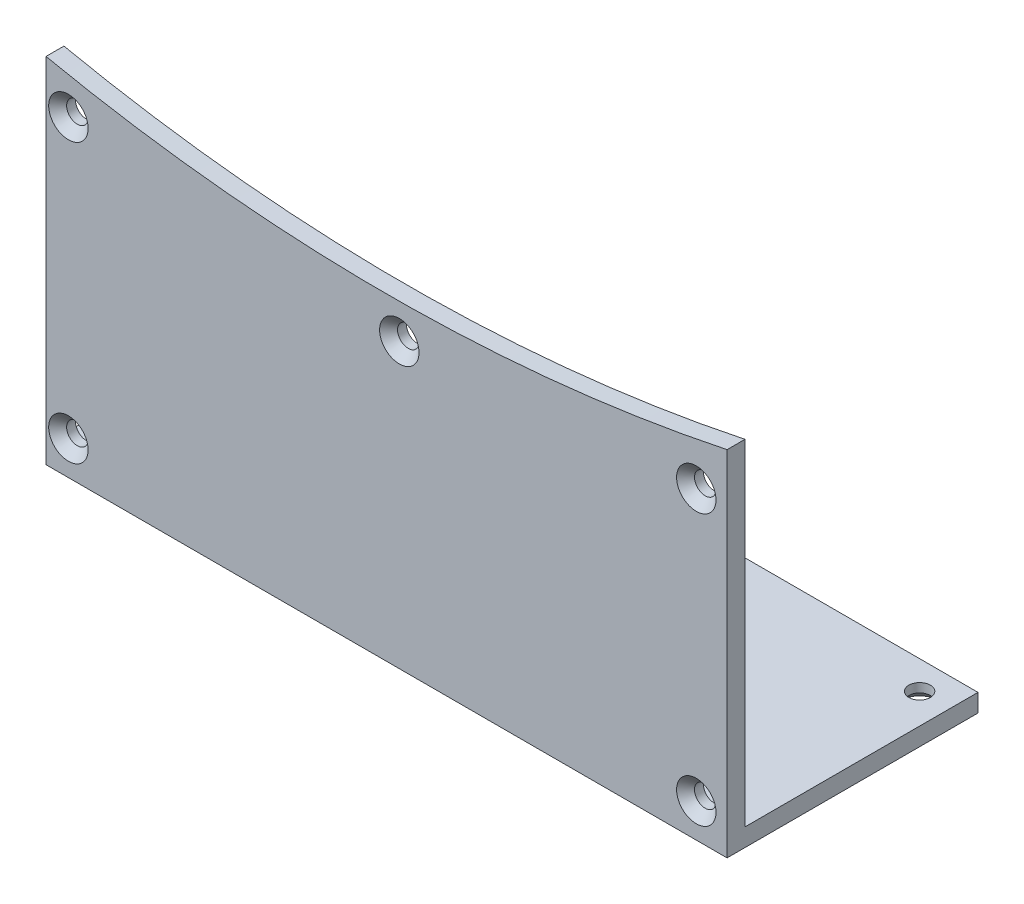
ISO-10303-21;
HEADER;
FILE_DESCRIPTION(('STEP AP214'),'2;1');
FILE_NAME('part.step','',(''),(''),'','','');
FILE_SCHEMA(('AUTOMOTIVE_DESIGN { 1 0 10303 214 1 1 1 1 }'));
ENDSEC;
DATA;
#1=APPLICATION_CONTEXT('core data for automotive mechanical design processes');
#2=APPLICATION_PROTOCOL_DEFINITION('international standard','automotive_design',2000,#1);
#3=PRODUCT_CONTEXT('',#1,'mechanical');
#4=PRODUCT('Part','Part','',(#3));
#5=PRODUCT_RELATED_PRODUCT_CATEGORY('part','',(#4));
#6=PRODUCT_DEFINITION_FORMATION('','',#4);
#7=PRODUCT_DEFINITION_CONTEXT('part definition',#1,'design');
#8=PRODUCT_DEFINITION('design','',#6,#7);
#9=PRODUCT_DEFINITION_SHAPE('','',#8);
#10=(LENGTH_UNIT() NAMED_UNIT(*) SI_UNIT(.MILLI.,.METRE.));
#11=(NAMED_UNIT(*) PLANE_ANGLE_UNIT() SI_UNIT($,.RADIAN.));
#12=(NAMED_UNIT(*) SI_UNIT($,.STERADIAN.) SOLID_ANGLE_UNIT());
#13=UNCERTAINTY_MEASURE_WITH_UNIT(LENGTH_MEASURE(1.E-05),#10,'distance_accuracy_value','');
#14=(GEOMETRIC_REPRESENTATION_CONTEXT(3) GLOBAL_UNCERTAINTY_ASSIGNED_CONTEXT((#13)) GLOBAL_UNIT_ASSIGNED_CONTEXT((#10,
#11,#12)) REPRESENTATION_CONTEXT('',''));
#15=CARTESIAN_POINT('',(0.,0.,0.));
#16=DIRECTION('',(0.,0.,1.));
#17=DIRECTION('',(1.,0.,0.));
#18=AXIS2_PLACEMENT_3D('',#15,#16,#17);
#19=CARTESIAN_POINT('',(0.,0.,-2.));
#20=DIRECTION('',(0.,0.,1.));
#21=DIRECTION('',(1.,0.,0.));
#22=AXIS2_PLACEMENT_3D('',#19,#20,#21);
#23=PLANE('',#22);
#24=CARTESIAN_POINT('',(-35.5,-216.21763850369,-2.));
#25=DIRECTION('',(0.,0.,1.));
#26=DIRECTION('',(1.,0.,0.));
#27=AXIS2_PLACEMENT_3D('',#24,#25,#26);
#28=CIRCLE('',#27,1.2);
#29=CARTESIAN_POINT('',(-34.3,-216.21763850369,-2.));
#30=VERTEX_POINT('',#29);
#31=EDGE_CURVE('E129',#30,#30,#28,.T.);
#32=ORIENTED_EDGE('',*,*,#31,.T.);
#33=EDGE_LOOP('',(#32));
#34=FACE_BOUND('',#33,.T.);
#35=CARTESIAN_POINT('',(-35.5,-185.148473071372,-2.));
#36=DIRECTION('',(0.,0.,1.));
#37=DIRECTION('',(1.,0.,0.));
#38=AXIS2_PLACEMENT_3D('',#35,#36,#37);
#39=CIRCLE('',#38,1.2);
#40=CARTESIAN_POINT('',(-34.3,-185.148473071372,-2.));
#41=VERTEX_POINT('',#40);
#42=EDGE_CURVE('E124',#41,#41,#39,.T.);
#43=ORIENTED_EDGE('',*,*,#42,.T.);
#44=EDGE_LOOP('',(#43));
#45=FACE_BOUND('',#44,.T.);
#46=CARTESIAN_POINT('',(1.42507067583593,-188.349538600762,-2.));
#47=DIRECTION('',(0.,0.,1.));
#48=DIRECTION('',(1.,0.,0.));
#49=AXIS2_PLACEMENT_3D('',#46,#47,#48);
#50=CIRCLE('',#49,1.19999999999999);
#51=CARTESIAN_POINT('',(2.62507067583592,-188.349538600762,-2.));
#52=VERTEX_POINT('',#51);
#53=EDGE_CURVE('E119',#52,#52,#50,.T.);
#54=ORIENTED_EDGE('',*,*,#53,.T.);
#55=EDGE_LOOP('',(#54));
#56=FACE_BOUND('',#55,.T.);
#57=CARTESIAN_POINT('',(34.5655138036417,-186.027196942185,-2.));
#58=DIRECTION('',(0.,0.,1.));
#59=DIRECTION('',(1.,0.,0.));
#60=AXIS2_PLACEMENT_3D('',#57,#58,#59);
#61=CIRCLE('',#60,1.19999999999999);
#62=CARTESIAN_POINT('',(35.7655138036417,-186.027196942185,-2.));
#63=VERTEX_POINT('',#62);
#64=EDGE_CURVE('E114',#63,#63,#61,.T.);
#65=ORIENTED_EDGE('',*,*,#64,.T.);
#66=EDGE_LOOP('',(#65));
#67=FACE_BOUND('',#66,.T.);
#68=CARTESIAN_POINT('',(34.5655138036417,-216.21763850369,-2.));
#69=DIRECTION('',(0.,0.,1.));
#70=DIRECTION('',(1.,0.,0.));
#71=AXIS2_PLACEMENT_3D('',#68,#69,#70);
#72=CIRCLE('',#71,1.19999999999999);
#73=CARTESIAN_POINT('',(35.7655138036417,-216.21763850369,-2.));
#74=VERTEX_POINT('',#73);
#75=EDGE_CURVE('E110',#74,#74,#72,.T.);
#76=ORIENTED_EDGE('',*,*,#75,.T.);
#77=EDGE_LOOP('',(#76));
#78=FACE_BOUND('',#77,.T.);
#79=DIRECTION('',(1.,0.,0.));
#80=VECTOR('',#79,1.);
#81=CARTESIAN_POINT('',(-38.,-218.,-2.));
#82=LINE('',#81,#80);
#83=CARTESIAN_POINT('',(-38.,-218.,-2.));
#84=VERTEX_POINT('',#83);
#85=CARTESIAN_POINT('',(38.,-218.,-2.));
#86=VERTEX_POINT('',#85);
#87=EDGE_CURVE('E50',#84,#86,#82,.T.);
#88=ORIENTED_EDGE('',*,*,#87,.F.);
#89=DIRECTION('',(0.,-1.,0.));
#90=VECTOR('',#89,1.);
#91=CARTESIAN_POINT('',(-38.,-180.544315889479,-2.));
#92=LINE('',#91,#90);
#93=CARTESIAN_POINT('',(-38.,-180.544315889479,-2.));
#94=VERTEX_POINT('',#93);
#95=EDGE_CURVE('E109',#94,#84,#92,.T.);
#96=ORIENTED_EDGE('',*,*,#95,.F.);
#97=CARTESIAN_POINT('',(0.,0.,-2.));
#98=DIRECTION('',(0.,0.,-1.));
#99=DIRECTION('',(1.,0.,0.));
#100=AXIS2_PLACEMENT_3D('',#97,#98,#99);
#101=CIRCLE('',#100,184.5);
#102=CARTESIAN_POINT('',(38.,-180.544315889479,-2.));
#103=VERTEX_POINT('',#102);
#104=EDGE_CURVE('E100',#103,#94,#101,.T.);
#105=ORIENTED_EDGE('',*,*,#104,.F.);
#106=DIRECTION('',(0.,1.,0.));
#107=VECTOR('',#106,1.);
#108=CARTESIAN_POINT('',(38.,-220.,-2.));
#109=LINE('',#108,#107);
#110=EDGE_CURVE('E98',#86,#103,#109,.T.);
#111=ORIENTED_EDGE('',*,*,#110,.F.);
#112=EDGE_LOOP('',(#88,#96,#105,#111));
#113=FACE_BOUND('',#112,.T.);
#114=ADVANCED_FACE('F33',(#34,#45,#56,#67,#78,#113),#23,.F.);
#115=CARTESIAN_POINT('',(-38.,-220.,-2.));
#116=DIRECTION('',(0.,-1.,0.));
#117=DIRECTION('',(0.,0.,-1.));
#118=AXIS2_PLACEMENT_3D('',#115,#116,#117);
#119=PLANE('',#118);
#120=CARTESIAN_POINT('',(34.6439633192261,-220.,-24.8415260383013));
#121=DIRECTION('',(0.,-1.,0.));
#122=DIRECTION('',(0.,0.,-1.));
#123=AXIS2_PLACEMENT_3D('',#120,#121,#122);
#124=CIRCLE('',#123,2.2);
#125=CARTESIAN_POINT('',(34.6439633192261,-220.,-27.0415260383013));
#126=VERTEX_POINT('',#125);
#127=EDGE_CURVE('E455',#126,#126,#124,.T.);
#128=ORIENTED_EDGE('',*,*,#127,.F.);
#129=EDGE_LOOP('',(#128));
#130=FACE_BOUND('',#129,.T.);
#131=CARTESIAN_POINT('',(0.,-220.,-25.6881159443765));
#132=DIRECTION('',(0.,-1.,0.));
#133=DIRECTION('',(0.,0.,-1.));
#134=AXIS2_PLACEMENT_3D('',#131,#132,#133);
#135=CIRCLE('',#134,2.2);
#136=CARTESIAN_POINT('',(0.,-220.,-27.8881159443765));
#137=VERTEX_POINT('',#136);
#138=EDGE_CURVE('E147',#137,#137,#135,.T.);
#139=ORIENTED_EDGE('',*,*,#138,.F.);
#140=EDGE_LOOP('',(#139));
#141=FACE_BOUND('',#140,.T.);
#142=CARTESIAN_POINT('',(-32.9665594764776,-220.,-23.5051324718256));
#143=DIRECTION('',(0.,-1.,0.));
#144=DIRECTION('',(0.,0.,-1.));
#145=AXIS2_PLACEMENT_3D('',#142,#143,#144);
#146=CIRCLE('',#145,2.2);
#147=CARTESIAN_POINT('',(-32.9665594764776,-220.,-25.7051324718256));
#148=VERTEX_POINT('',#147);
#149=EDGE_CURVE('E140',#148,#148,#146,.T.);
#150=ORIENTED_EDGE('',*,*,#149,.F.);
#151=EDGE_LOOP('',(#150));
#152=FACE_BOUND('',#151,.T.);
#153=DIRECTION('',(1.,0.,0.));
#154=VECTOR('',#153,1.);
#155=CARTESIAN_POINT('',(-38.,-220.,0.));
#156=LINE('',#155,#154);
#157=CARTESIAN_POINT('',(-38.,-220.,0.));
#158=VERTEX_POINT('',#157);
#159=CARTESIAN_POINT('',(38.,-220.,0.));
#160=VERTEX_POINT('',#159);
#161=EDGE_CURVE('E86',#158,#160,#156,.T.);
#162=ORIENTED_EDGE('',*,*,#161,.F.);
#163=DIRECTION('',(0.,0.,1.));
#164=VECTOR('',#163,1.);
#165=CARTESIAN_POINT('',(-38.,-220.,-2.));
#166=LINE('',#165,#164);
#167=CARTESIAN_POINT('',(-38.,-220.,-28.));
#168=VERTEX_POINT('',#167);
#169=EDGE_CURVE('E11',#168,#158,#166,.T.);
#170=ORIENTED_EDGE('',*,*,#169,.F.);
#171=DIRECTION('',(1.,0.,0.));
#172=VECTOR('',#171,1.);
#173=CARTESIAN_POINT('',(-38.,-220.,-28.));
#174=LINE('',#173,#172);
#175=CARTESIAN_POINT('',(38.,-220.,-28.));
#176=VERTEX_POINT('',#175);
#177=EDGE_CURVE('E184',#168,#176,#174,.T.);
#178=ORIENTED_EDGE('',*,*,#177,.T.);
#179=DIRECTION('',(0.,0.,1.));
#180=VECTOR('',#179,1.);
#181=CARTESIAN_POINT('',(38.,-220.,-2.));
#182=LINE('',#181,#180);
#183=EDGE_CURVE('E88',#176,#160,#182,.T.);
#184=ORIENTED_EDGE('',*,*,#183,.T.);
#185=EDGE_LOOP('',(#162,#170,#178,#184));
#186=FACE_BOUND('',#185,.T.);
#187=ADVANCED_FACE('F35',(#130,#141,#152,#186),#119,.T.);
#188=CARTESIAN_POINT('',(-38.,-180.544315889479,-2.));
#189=DIRECTION('',(-1.,0.,0.));
#190=DIRECTION('',(0.,0.,1.));
#191=AXIS2_PLACEMENT_3D('',#188,#189,#190);
#192=PLANE('',#191);
#193=DIRECTION('',(0.,-1.,0.));
#194=VECTOR('',#193,1.);
#195=CARTESIAN_POINT('',(-38.,-180.544315889479,0.));
#196=LINE('',#195,#194);
#197=CARTESIAN_POINT('',(-38.,-180.544315889479,0.));
#198=VERTEX_POINT('',#197);
#199=EDGE_CURVE('E77',#198,#158,#196,.T.);
#200=ORIENTED_EDGE('',*,*,#199,.F.);
#201=DIRECTION('',(0.,0.,1.));
#202=VECTOR('',#201,1.);
#203=CARTESIAN_POINT('',(-38.,-180.544315889479,-2.));
#204=LINE('',#203,#202);
#205=EDGE_CURVE('E42',#94,#198,#204,.T.);
#206=ORIENTED_EDGE('',*,*,#205,.F.);
#207=ORIENTED_EDGE('',*,*,#95,.T.);
#208=DIRECTION('',(0.,0.,1.));
#209=VECTOR('',#208,1.);
#210=CARTESIAN_POINT('',(-38.,-218.,-104.026311234993));
#211=LINE('',#210,#209);
#212=CARTESIAN_POINT('',(-38.,-218.,-28.));
#213=VERTEX_POINT('',#212);
#214=EDGE_CURVE('E181',#213,#84,#211,.T.);
#215=ORIENTED_EDGE('',*,*,#214,.F.);
#216=DIRECTION('',(0.,-1.,0.));
#217=VECTOR('',#216,1.);
#218=CARTESIAN_POINT('',(-38.,-220.,-28.));
#219=LINE('',#218,#217);
#220=EDGE_CURVE('E81',#213,#168,#219,.T.);
#221=ORIENTED_EDGE('',*,*,#220,.T.);
#222=ORIENTED_EDGE('',*,*,#169,.T.);
#223=EDGE_LOOP('',(#200,#206,#207,#215,#221,#222));
#224=FACE_BOUND('',#223,.T.);
#225=ADVANCED_FACE('F75',(#224),#192,.T.);
#226=CARTESIAN_POINT('',(0.,0.,-2.));
#227=DIRECTION('',(0.,0.,1.));
#228=DIRECTION('',(1.,0.,0.));
#229=AXIS2_PLACEMENT_3D('',#226,#227,#228);
#230=CYLINDRICAL_SURFACE('',#229,184.5);
#231=CARTESIAN_POINT('',(0.,0.,0.));
#232=DIRECTION('',(0.,0.,-1.));
#233=DIRECTION('',(1.,0.,0.));
#234=AXIS2_PLACEMENT_3D('',#231,#232,#233);
#235=CIRCLE('',#234,184.5);
#236=CARTESIAN_POINT('',(38.,-180.544315889479,0.));
#237=VERTEX_POINT('',#236);
#238=EDGE_CURVE('E97',#237,#198,#235,.T.);
#239=ORIENTED_EDGE('',*,*,#238,.F.);
#240=DIRECTION('',(0.,0.,1.));
#241=VECTOR('',#240,1.);
#242=CARTESIAN_POINT('',(38.,-180.544315889479,-2.));
#243=LINE('',#242,#241);
#244=EDGE_CURVE('E106',#103,#237,#243,.T.);
#245=ORIENTED_EDGE('',*,*,#244,.F.);
#246=ORIENTED_EDGE('',*,*,#104,.T.);
#247=ORIENTED_EDGE('',*,*,#205,.T.);
#248=EDGE_LOOP('',(#239,#245,#246,#247));
#249=FACE_BOUND('',#248,.T.);
#250=ADVANCED_FACE('F201',(#249),#230,.F.);
#251=CARTESIAN_POINT('',(38.,-220.,-2.));
#252=DIRECTION('',(1.,0.,0.));
#253=DIRECTION('',(0.,0.,-1.));
#254=AXIS2_PLACEMENT_3D('',#251,#252,#253);
#255=PLANE('',#254);
#256=DIRECTION('',(0.,1.,0.));
#257=VECTOR('',#256,1.);
#258=CARTESIAN_POINT('',(38.,-220.,0.));
#259=LINE('',#258,#257);
#260=EDGE_CURVE('E92',#160,#237,#259,.T.);
#261=ORIENTED_EDGE('',*,*,#260,.F.);
#262=ORIENTED_EDGE('',*,*,#183,.F.);
#263=DIRECTION('',(0.,1.,0.));
#264=VECTOR('',#263,1.);
#265=CARTESIAN_POINT('',(38.,-220.,-28.));
#266=LINE('',#265,#264);
#267=CARTESIAN_POINT('',(38.,-218.,-28.));
#268=VERTEX_POINT('',#267);
#269=EDGE_CURVE('E186',#176,#268,#266,.T.);
#270=ORIENTED_EDGE('',*,*,#269,.T.);
#271=DIRECTION('',(0.,0.,1.));
#272=VECTOR('',#271,1.);
#273=CARTESIAN_POINT('',(38.,-218.,-104.026311234993));
#274=LINE('',#273,#272);
#275=EDGE_CURVE('E178',#268,#86,#274,.T.);
#276=ORIENTED_EDGE('',*,*,#275,.T.);
#277=ORIENTED_EDGE('',*,*,#110,.T.);
#278=ORIENTED_EDGE('',*,*,#244,.T.);
#279=EDGE_LOOP('',(#261,#262,#270,#276,#277,#278));
#280=FACE_BOUND('',#279,.T.);
#281=ADVANCED_FACE('F195',(#280),#255,.T.);
#282=CARTESIAN_POINT('',(0.,0.,0.));
#283=DIRECTION('',(0.,0.,1.));
#284=DIRECTION('',(1.,0.,0.));
#285=AXIS2_PLACEMENT_3D('',#282,#283,#284);
#286=PLANE('',#285);
#287=CARTESIAN_POINT('',(-35.5,-216.21763850369,0.));
#288=DIRECTION('',(0.,0.,1.));
#289=DIRECTION('',(1.,0.,0.));
#290=AXIS2_PLACEMENT_3D('',#287,#288,#289);
#291=CIRCLE('',#290,2.2);
#292=CARTESIAN_POINT('',(-33.3,-216.21763850369,0.));
#293=VERTEX_POINT('',#292);
#294=EDGE_CURVE('E136',#293,#293,#291,.T.);
#295=ORIENTED_EDGE('',*,*,#294,.F.);
#296=EDGE_LOOP('',(#295));
#297=FACE_BOUND('',#296,.T.);
#298=CARTESIAN_POINT('',(-35.5,-185.148473071372,0.));
#299=DIRECTION('',(0.,0.,1.));
#300=DIRECTION('',(1.,0.,0.));
#301=AXIS2_PLACEMENT_3D('',#298,#299,#300);
#302=CIRCLE('',#301,2.2);
#303=CARTESIAN_POINT('',(-33.3,-185.148473071372,0.));
#304=VERTEX_POINT('',#303);
#305=EDGE_CURVE('E132',#304,#304,#302,.T.);
#306=ORIENTED_EDGE('',*,*,#305,.F.);
#307=EDGE_LOOP('',(#306));
#308=FACE_BOUND('',#307,.T.);
#309=CARTESIAN_POINT('',(1.42507067583593,-188.349538600762,0.));
#310=DIRECTION('',(0.,0.,1.));
#311=DIRECTION('',(1.,0.,0.));
#312=AXIS2_PLACEMENT_3D('',#309,#310,#311);
#313=CIRCLE('',#312,2.2);
#314=CARTESIAN_POINT('',(3.62507067583593,-188.349538600762,0.));
#315=VERTEX_POINT('',#314);
#316=EDGE_CURVE('E127',#315,#315,#313,.T.);
#317=ORIENTED_EDGE('',*,*,#316,.F.);
#318=EDGE_LOOP('',(#317));
#319=FACE_BOUND('',#318,.T.);
#320=CARTESIAN_POINT('',(34.5655138036417,-186.027196942185,0.));
#321=DIRECTION('',(0.,0.,1.));
#322=DIRECTION('',(1.,0.,0.));
#323=AXIS2_PLACEMENT_3D('',#320,#321,#322);
#324=CIRCLE('',#323,2.2);
#325=CARTESIAN_POINT('',(36.7655138036417,-186.027196942185,0.));
#326=VERTEX_POINT('',#325);
#327=EDGE_CURVE('E122',#326,#326,#324,.T.);
#328=ORIENTED_EDGE('',*,*,#327,.F.);
#329=EDGE_LOOP('',(#328));
#330=FACE_BOUND('',#329,.T.);
#331=CARTESIAN_POINT('',(34.5655138036417,-216.21763850369,0.));
#332=DIRECTION('',(0.,0.,1.));
#333=DIRECTION('',(1.,0.,0.));
#334=AXIS2_PLACEMENT_3D('',#331,#332,#333);
#335=CIRCLE('',#334,2.2);
#336=CARTESIAN_POINT('',(36.7655138036417,-216.21763850369,0.));
#337=VERTEX_POINT('',#336);
#338=EDGE_CURVE('E117',#337,#337,#335,.T.);
#339=ORIENTED_EDGE('',*,*,#338,.F.);
#340=EDGE_LOOP('',(#339));
#341=FACE_BOUND('',#340,.T.);
#342=ORIENTED_EDGE('',*,*,#161,.T.);
#343=ORIENTED_EDGE('',*,*,#260,.T.);
#344=ORIENTED_EDGE('',*,*,#238,.T.);
#345=ORIENTED_EDGE('',*,*,#199,.T.);
#346=EDGE_LOOP('',(#342,#343,#344,#345));
#347=FACE_BOUND('',#346,.T.);
#348=ADVANCED_FACE('F95',(#297,#308,#319,#330,#341,#347),#286,.T.);
#349=CARTESIAN_POINT('',(-38.,-218.,-104.026311234993));
#350=DIRECTION('',(0.,-1.,0.));
#351=DIRECTION('',(0.,0.,-1.));
#352=AXIS2_PLACEMENT_3D('',#349,#350,#351);
#353=PLANE('',#352);
#354=CARTESIAN_POINT('',(34.6439633192261,-218.,-24.8415260383013));
#355=DIRECTION('',(0.,-1.,0.));
#356=DIRECTION('',(0.,0.,-1.));
#357=AXIS2_PLACEMENT_3D('',#354,#355,#356);
#358=CIRCLE('',#357,1.19999999999999);
#359=CARTESIAN_POINT('',(34.6439633192261,-218.,-26.0415260383012));
#360=VERTEX_POINT('',#359);
#361=EDGE_CURVE('E37',#360,#360,#358,.T.);
#362=ORIENTED_EDGE('',*,*,#361,.T.);
#363=EDGE_LOOP('',(#362));
#364=FACE_BOUND('',#363,.T.);
#365=CARTESIAN_POINT('',(0.,-218.,-25.6881159443765));
#366=DIRECTION('',(0.,-1.,0.));
#367=DIRECTION('',(0.,0.,-1.));
#368=AXIS2_PLACEMENT_3D('',#365,#366,#367);
#369=CIRCLE('',#368,1.19999999999999);
#370=CARTESIAN_POINT('',(0.,-218.,-26.8881159443765));
#371=VERTEX_POINT('',#370);
#372=EDGE_CURVE('E138',#371,#371,#369,.T.);
#373=ORIENTED_EDGE('',*,*,#372,.T.);
#374=EDGE_LOOP('',(#373));
#375=FACE_BOUND('',#374,.T.);
#376=CARTESIAN_POINT('',(-32.9665594764776,-218.,-23.5051324718256));
#377=DIRECTION('',(0.,-1.,0.));
#378=DIRECTION('',(0.,0.,-1.));
#379=AXIS2_PLACEMENT_3D('',#376,#377,#378);
#380=CIRCLE('',#379,1.19999999999999);
#381=CARTESIAN_POINT('',(-32.9665594764776,-218.,-24.7051324718256));
#382=VERTEX_POINT('',#381);
#383=EDGE_CURVE('E134',#382,#382,#380,.T.);
#384=ORIENTED_EDGE('',*,*,#383,.T.);
#385=EDGE_LOOP('',(#384));
#386=FACE_BOUND('',#385,.T.);
#387=ORIENTED_EDGE('',*,*,#275,.F.);
#388=DIRECTION('',(-1.,0.,0.));
#389=VECTOR('',#388,1.);
#390=CARTESIAN_POINT('',(-38.,-218.,-28.));
#391=LINE('',#390,#389);
#392=EDGE_CURVE('E189',#268,#213,#391,.T.);
#393=ORIENTED_EDGE('',*,*,#392,.T.);
#394=ORIENTED_EDGE('',*,*,#214,.T.);
#395=ORIENTED_EDGE('',*,*,#87,.T.);
#396=EDGE_LOOP('',(#387,#393,#394,#395));
#397=FACE_BOUND('',#396,.T.);
#398=ADVANCED_FACE('F205',(#364,#375,#386,#397),#353,.F.);
#399=CARTESIAN_POINT('',(0.,0.,-28.));
#400=DIRECTION('',(0.,0.,1.));
#401=DIRECTION('',(1.,0.,0.));
#402=AXIS2_PLACEMENT_3D('',#399,#400,#401);
#403=PLANE('',#402);
#404=ORIENTED_EDGE('',*,*,#392,.F.);
#405=ORIENTED_EDGE('',*,*,#269,.F.);
#406=ORIENTED_EDGE('',*,*,#177,.F.);
#407=ORIENTED_EDGE('',*,*,#220,.F.);
#408=EDGE_LOOP('',(#404,#405,#406,#407));
#409=FACE_BOUND('',#408,.T.);
#410=ADVANCED_FACE('F210',(#409),#403,.F.);
#411=CARTESIAN_POINT('',(34.5655138036417,-216.21763850369,0.));
#412=DIRECTION('',(0.,0.,1.));
#413=DIRECTION('',(1.,0.,0.));
#414=AXIS2_PLACEMENT_3D('',#411,#412,#413);
#415=CYLINDRICAL_SURFACE('',#414,1.19999999999999);
#416=CARTESIAN_POINT('',(34.5655138036417,-216.21763850369,-1.00000000000001));
#417=DIRECTION('',(0.,0.,1.));
#418=DIRECTION('',(1.,0.,0.));
#419=AXIS2_PLACEMENT_3D('',#416,#417,#418);
#420=CIRCLE('',#419,1.19999999999999);
#421=CARTESIAN_POINT('',(35.7655138036417,-216.21763850369,-1.00000000000001));
#422=VERTEX_POINT('',#421);
#423=EDGE_CURVE('E113',#422,#422,#420,.T.);
#424=ORIENTED_EDGE('',*,*,#423,.T.);
#425=EDGE_LOOP('',(#424));
#426=FACE_BOUND('',#425,.T.);
#427=ORIENTED_EDGE('',*,*,#75,.F.);
#428=EDGE_LOOP('',(#427));
#429=FACE_BOUND('',#428,.T.);
#430=ADVANCED_FACE('F215',(#426,#429),#415,.F.);
#431=CARTESIAN_POINT('',(34.5655138036417,-216.21763850369,0.));
#432=DIRECTION('',(0.,0.,1.));
#433=DIRECTION('',(1.,0.,0.));
#434=AXIS2_PLACEMENT_3D('',#431,#432,#433);
#435=CONICAL_SURFACE('',#434,2.2,0.785398163397448);
#436=ORIENTED_EDGE('',*,*,#423,.F.);
#437=EDGE_LOOP('',(#436));
#438=FACE_BOUND('',#437,.T.);
#439=ORIENTED_EDGE('',*,*,#338,.T.);
#440=EDGE_LOOP('',(#439));
#441=FACE_BOUND('',#440,.T.);
#442=ADVANCED_FACE('F222',(#438,#441),#435,.F.);
#443=CARTESIAN_POINT('',(34.5655138036417,-186.027196942185,0.));
#444=DIRECTION('',(0.,0.,1.));
#445=DIRECTION('',(1.,0.,0.));
#446=AXIS2_PLACEMENT_3D('',#443,#444,#445);
#447=CYLINDRICAL_SURFACE('',#446,1.19999999999999);
#448=CARTESIAN_POINT('',(34.5655138036417,-186.027196942185,-1.00000000000001));
#449=DIRECTION('',(0.,0.,1.));
#450=DIRECTION('',(1.,0.,0.));
#451=AXIS2_PLACEMENT_3D('',#448,#449,#450);
#452=CIRCLE('',#451,1.19999999999999);
#453=CARTESIAN_POINT('',(35.7655138036417,-186.027196942185,-1.00000000000001));
#454=VERTEX_POINT('',#453);
#455=EDGE_CURVE('E118',#454,#454,#452,.T.);
#456=ORIENTED_EDGE('',*,*,#455,.T.);
#457=EDGE_LOOP('',(#456));
#458=FACE_BOUND('',#457,.T.);
#459=ORIENTED_EDGE('',*,*,#64,.F.);
#460=EDGE_LOOP('',(#459));
#461=FACE_BOUND('',#460,.T.);
#462=ADVANCED_FACE('F268',(#458,#461),#447,.F.);
#463=CARTESIAN_POINT('',(34.5655138036417,-186.027196942185,0.));
#464=DIRECTION('',(0.,0.,1.));
#465=DIRECTION('',(1.,0.,0.));
#466=AXIS2_PLACEMENT_3D('',#463,#464,#465);
#467=CONICAL_SURFACE('',#466,2.2,0.785398163397448);
#468=ORIENTED_EDGE('',*,*,#455,.F.);
#469=EDGE_LOOP('',(#468));
#470=FACE_BOUND('',#469,.T.);
#471=ORIENTED_EDGE('',*,*,#327,.T.);
#472=EDGE_LOOP('',(#471));
#473=FACE_BOUND('',#472,.T.);
#474=ADVANCED_FACE('F276',(#470,#473),#467,.F.);
#475=CARTESIAN_POINT('',(1.42507067583593,-188.349538600762,0.));
#476=DIRECTION('',(0.,0.,1.));
#477=DIRECTION('',(1.,0.,0.));
#478=AXIS2_PLACEMENT_3D('',#475,#476,#477);
#479=CYLINDRICAL_SURFACE('',#478,1.19999999999999);
#480=CARTESIAN_POINT('',(1.42507067583593,-188.349538600762,-1.00000000000001));
#481=DIRECTION('',(0.,0.,1.));
#482=DIRECTION('',(1.,0.,0.));
#483=AXIS2_PLACEMENT_3D('',#480,#481,#482);
#484=CIRCLE('',#483,1.2);
#485=CARTESIAN_POINT('',(2.62507067583592,-188.349538600762,-1.00000000000001));
#486=VERTEX_POINT('',#485);
#487=EDGE_CURVE('E123',#486,#486,#484,.T.);
#488=ORIENTED_EDGE('',*,*,#487,.T.);
#489=EDGE_LOOP('',(#488));
#490=FACE_BOUND('',#489,.T.);
#491=ORIENTED_EDGE('',*,*,#53,.F.);
#492=EDGE_LOOP('',(#491));
#493=FACE_BOUND('',#492,.T.);
#494=ADVANCED_FACE('F284',(#490,#493),#479,.F.);
#495=CARTESIAN_POINT('',(1.42507067583593,-188.349538600762,0.));
#496=DIRECTION('',(0.,0.,1.));
#497=DIRECTION('',(1.,0.,0.));
#498=AXIS2_PLACEMENT_3D('',#495,#496,#497);
#499=CONICAL_SURFACE('',#498,2.2,0.785398163397446);
#500=ORIENTED_EDGE('',*,*,#487,.F.);
#501=EDGE_LOOP('',(#500));
#502=FACE_BOUND('',#501,.T.);
#503=ORIENTED_EDGE('',*,*,#316,.T.);
#504=EDGE_LOOP('',(#503));
#505=FACE_BOUND('',#504,.T.);
#506=ADVANCED_FACE('F292',(#502,#505),#499,.F.);
#507=CARTESIAN_POINT('',(-35.5,-185.148473071372,0.));
#508=DIRECTION('',(0.,0.,1.));
#509=DIRECTION('',(1.,0.,0.));
#510=AXIS2_PLACEMENT_3D('',#507,#508,#509);
#511=CYLINDRICAL_SURFACE('',#510,1.2);
#512=CARTESIAN_POINT('',(-35.5,-185.148473071372,-1.00000000000001));
#513=DIRECTION('',(0.,0.,1.));
#514=DIRECTION('',(1.,0.,0.));
#515=AXIS2_PLACEMENT_3D('',#512,#513,#514);
#516=CIRCLE('',#515,1.2);
#517=CARTESIAN_POINT('',(-34.3,-185.148473071372,-1.00000000000001));
#518=VERTEX_POINT('',#517);
#519=EDGE_CURVE('E128',#518,#518,#516,.T.);
#520=ORIENTED_EDGE('',*,*,#519,.T.);
#521=EDGE_LOOP('',(#520));
#522=FACE_BOUND('',#521,.T.);
#523=ORIENTED_EDGE('',*,*,#42,.F.);
#524=EDGE_LOOP('',(#523));
#525=FACE_BOUND('',#524,.T.);
#526=ADVANCED_FACE('F300',(#522,#525),#511,.F.);
#527=CARTESIAN_POINT('',(-35.5,-185.148473071372,0.));
#528=DIRECTION('',(0.,0.,1.));
#529=DIRECTION('',(1.,0.,0.));
#530=AXIS2_PLACEMENT_3D('',#527,#528,#529);
#531=CONICAL_SURFACE('',#530,2.2,0.785398163397445);
#532=ORIENTED_EDGE('',*,*,#519,.F.);
#533=EDGE_LOOP('',(#532));
#534=FACE_BOUND('',#533,.T.);
#535=ORIENTED_EDGE('',*,*,#305,.T.);
#536=EDGE_LOOP('',(#535));
#537=FACE_BOUND('',#536,.T.);
#538=ADVANCED_FACE('F308',(#534,#537),#531,.F.);
#539=CARTESIAN_POINT('',(-35.5,-216.21763850369,0.));
#540=DIRECTION('',(0.,0.,1.));
#541=DIRECTION('',(1.,0.,0.));
#542=AXIS2_PLACEMENT_3D('',#539,#540,#541);
#543=CYLINDRICAL_SURFACE('',#542,1.2);
#544=CARTESIAN_POINT('',(-35.5,-216.21763850369,-1.00000000000001));
#545=DIRECTION('',(0.,0.,1.));
#546=DIRECTION('',(1.,0.,0.));
#547=AXIS2_PLACEMENT_3D('',#544,#545,#546);
#548=CIRCLE('',#547,1.2);
#549=CARTESIAN_POINT('',(-34.3,-216.21763850369,-1.00000000000001));
#550=VERTEX_POINT('',#549);
#551=EDGE_CURVE('E133',#550,#550,#548,.T.);
#552=ORIENTED_EDGE('',*,*,#551,.T.);
#553=EDGE_LOOP('',(#552));
#554=FACE_BOUND('',#553,.T.);
#555=ORIENTED_EDGE('',*,*,#31,.F.);
#556=EDGE_LOOP('',(#555));
#557=FACE_BOUND('',#556,.T.);
#558=ADVANCED_FACE('F316',(#554,#557),#543,.F.);
#559=CARTESIAN_POINT('',(-35.5,-216.21763850369,0.));
#560=DIRECTION('',(0.,0.,1.));
#561=DIRECTION('',(1.,0.,0.));
#562=AXIS2_PLACEMENT_3D('',#559,#560,#561);
#563=CONICAL_SURFACE('',#562,2.2,0.785398163397445);
#564=ORIENTED_EDGE('',*,*,#551,.F.);
#565=EDGE_LOOP('',(#564));
#566=FACE_BOUND('',#565,.T.);
#567=ORIENTED_EDGE('',*,*,#294,.T.);
#568=EDGE_LOOP('',(#567));
#569=FACE_BOUND('',#568,.T.);
#570=ADVANCED_FACE('F324',(#566,#569),#563,.F.);
#571=CARTESIAN_POINT('',(-32.9665594764776,-220.,-23.5051324718256));
#572=DIRECTION('',(0.,-1.,0.));
#573=DIRECTION('',(0.,0.,-1.));
#574=AXIS2_PLACEMENT_3D('',#571,#572,#573);
#575=CYLINDRICAL_SURFACE('',#574,1.19999999999999);
#576=CARTESIAN_POINT('',(-32.9665594764776,-219.,-23.5051324718256));
#577=DIRECTION('',(0.,-1.,0.));
#578=DIRECTION('',(0.,0.,-1.));
#579=AXIS2_PLACEMENT_3D('',#576,#577,#578);
#580=CIRCLE('',#579,1.19999999999999);
#581=CARTESIAN_POINT('',(-32.9665594764776,-219.,-24.7051324718256));
#582=VERTEX_POINT('',#581);
#583=EDGE_CURVE('E137',#582,#582,#580,.T.);
#584=ORIENTED_EDGE('',*,*,#583,.T.);
#585=EDGE_LOOP('',(#584));
#586=FACE_BOUND('',#585,.T.);
#587=ORIENTED_EDGE('',*,*,#383,.F.);
#588=EDGE_LOOP('',(#587));
#589=FACE_BOUND('',#588,.T.);
#590=ADVANCED_FACE('F332',(#586,#589),#575,.F.);
#591=CARTESIAN_POINT('',(-32.9665594764776,-220.,-23.5051324718256));
#592=DIRECTION('',(0.,-1.,0.));
#593=DIRECTION('',(0.,0.,-1.));
#594=AXIS2_PLACEMENT_3D('',#591,#592,#593);
#595=CONICAL_SURFACE('',#594,2.2,0.785398163397455);
#596=ORIENTED_EDGE('',*,*,#583,.F.);
#597=EDGE_LOOP('',(#596));
#598=FACE_BOUND('',#597,.T.);
#599=ORIENTED_EDGE('',*,*,#149,.T.);
#600=EDGE_LOOP('',(#599));
#601=FACE_BOUND('',#600,.T.);
#602=ADVANCED_FACE('F339',(#598,#601),#595,.F.);
#603=CARTESIAN_POINT('',(0.,-220.,-25.6881159443765));
#604=DIRECTION('',(0.,-1.,0.));
#605=DIRECTION('',(0.,0.,-1.));
#606=AXIS2_PLACEMENT_3D('',#603,#604,#605);
#607=CYLINDRICAL_SURFACE('',#606,1.19999999999999);
#608=CARTESIAN_POINT('',(0.,-219.,-25.6881159443765));
#609=DIRECTION('',(0.,-1.,0.));
#610=DIRECTION('',(0.,0.,-1.));
#611=AXIS2_PLACEMENT_3D('',#608,#609,#610);
#612=CIRCLE('',#611,1.19999999999999);
#613=CARTESIAN_POINT('',(0.,-219.,-26.8881159443765));
#614=VERTEX_POINT('',#613);
#615=EDGE_CURVE('E141',#614,#614,#612,.T.);
#616=ORIENTED_EDGE('',*,*,#615,.T.);
#617=EDGE_LOOP('',(#616));
#618=FACE_BOUND('',#617,.T.);
#619=ORIENTED_EDGE('',*,*,#372,.F.);
#620=EDGE_LOOP('',(#619));
#621=FACE_BOUND('',#620,.T.);
#622=ADVANCED_FACE('F347',(#618,#621),#607,.F.);
#623=CARTESIAN_POINT('',(0.,-220.,-25.6881159443765));
#624=DIRECTION('',(0.,-1.,0.));
#625=DIRECTION('',(0.,0.,-1.));
#626=AXIS2_PLACEMENT_3D('',#623,#624,#625);
#627=CONICAL_SURFACE('',#626,2.2,0.785398163397454);
#628=ORIENTED_EDGE('',*,*,#615,.F.);
#629=EDGE_LOOP('',(#628));
#630=FACE_BOUND('',#629,.T.);
#631=ORIENTED_EDGE('',*,*,#138,.T.);
#632=EDGE_LOOP('',(#631));
#633=FACE_BOUND('',#632,.T.);
#634=ADVANCED_FACE('F355',(#630,#633),#627,.F.);
#635=CARTESIAN_POINT('',(34.6439633192261,-220.,-24.8415260383013));
#636=DIRECTION('',(0.,-1.,0.));
#637=DIRECTION('',(0.,0.,-1.));
#638=AXIS2_PLACEMENT_3D('',#635,#636,#637);
#639=CYLINDRICAL_SURFACE('',#638,1.19999999999999);
#640=CARTESIAN_POINT('',(34.6439633192261,-219.,-24.8415260383013));
#641=DIRECTION('',(0.,-1.,0.));
#642=DIRECTION('',(0.,0.,-1.));
#643=AXIS2_PLACEMENT_3D('',#640,#641,#642);
#644=CIRCLE('',#643,1.19999999999999);
#645=CARTESIAN_POINT('',(34.6439633192261,-219.,-26.0415260383012));
#646=VERTEX_POINT('',#645);
#647=EDGE_CURVE('E452',#646,#646,#644,.T.);
#648=ORIENTED_EDGE('',*,*,#647,.T.);
#649=EDGE_LOOP('',(#648));
#650=FACE_BOUND('',#649,.T.);
#651=ORIENTED_EDGE('',*,*,#361,.F.);
#652=EDGE_LOOP('',(#651));
#653=FACE_BOUND('',#652,.T.);
#654=ADVANCED_FACE('F362',(#650,#653),#639,.F.);
#655=CARTESIAN_POINT('',(34.6439633192261,-220.,-24.8415260383013));
#656=DIRECTION('',(0.,-1.,0.));
#657=DIRECTION('',(0.,0.,-1.));
#658=AXIS2_PLACEMENT_3D('',#655,#656,#657);
#659=CONICAL_SURFACE('',#658,2.2,0.785398163397455);
#660=ORIENTED_EDGE('',*,*,#647,.F.);
#661=EDGE_LOOP('',(#660));
#662=FACE_BOUND('',#661,.T.);
#663=ORIENTED_EDGE('',*,*,#127,.T.);
#664=EDGE_LOOP('',(#663));
#665=FACE_BOUND('',#664,.T.);
#666=ADVANCED_FACE('F370',(#662,#665),#659,.F.);
#667=CLOSED_SHELL('',(#114,#187,#225,#250,#281,#348,#398,#410,#430,#442,#462,#474,#494,#506,
#526,#538,#558,#570,#590,#602,#622,#634,#654,#666));
#668=MANIFOLD_SOLID_BREP('B2',#667);
#669=ADVANCED_BREP_SHAPE_REPRESENTATION('',(#18,#668),#14);
#670=SHAPE_DEFINITION_REPRESENTATION(#9,#669);
ENDSEC;
END-ISO-10303-21;
